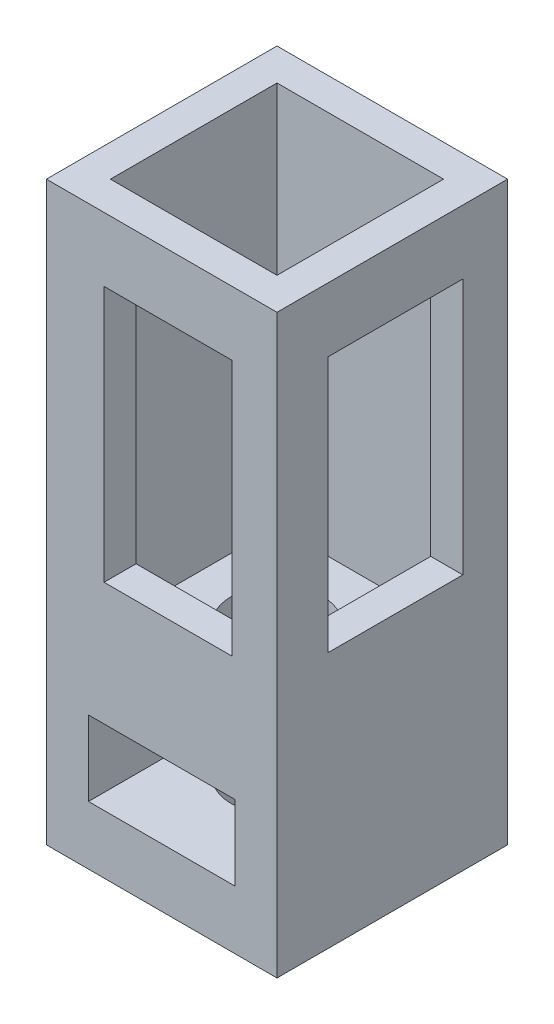
ISO-10303-21;
HEADER;
FILE_DESCRIPTION(('STEP AP214'),'2;1');
FILE_NAME('part.step','',(''),(''),'','','');
FILE_SCHEMA(('AUTOMOTIVE_DESIGN { 1 0 10303 214 1 1 1 1 }'));
ENDSEC;
DATA;
#1=APPLICATION_CONTEXT('core data for automotive mechanical design processes');
#2=APPLICATION_PROTOCOL_DEFINITION('international standard','automotive_design',2000,#1);
#3=PRODUCT_CONTEXT('',#1,'mechanical');
#4=PRODUCT('Part','Part','',(#3));
#5=PRODUCT_RELATED_PRODUCT_CATEGORY('part','',(#4));
#6=PRODUCT_DEFINITION_FORMATION('','',#4);
#7=PRODUCT_DEFINITION_CONTEXT('part definition',#1,'design');
#8=PRODUCT_DEFINITION('design','',#6,#7);
#9=PRODUCT_DEFINITION_SHAPE('','',#8);
#10=(LENGTH_UNIT() NAMED_UNIT(*) SI_UNIT(.MILLI.,.METRE.));
#11=(NAMED_UNIT(*) PLANE_ANGLE_UNIT() SI_UNIT($,.RADIAN.));
#12=(NAMED_UNIT(*) SI_UNIT($,.STERADIAN.) SOLID_ANGLE_UNIT());
#13=UNCERTAINTY_MEASURE_WITH_UNIT(LENGTH_MEASURE(1.E-05),#10,'distance_accuracy_value','');
#14=(GEOMETRIC_REPRESENTATION_CONTEXT(3) GLOBAL_UNCERTAINTY_ASSIGNED_CONTEXT((#13)) GLOBAL_UNIT_ASSIGNED_CONTEXT((#10,
#11,#12)) REPRESENTATION_CONTEXT('',''));
#15=CARTESIAN_POINT('',(0.,0.,0.));
#16=DIRECTION('',(0.,0.,1.));
#17=DIRECTION('',(1.,0.,0.));
#18=AXIS2_PLACEMENT_3D('',#15,#16,#17);
#19=CARTESIAN_POINT('',(0.,35.,0.));
#20=DIRECTION('',(1.,0.,0.));
#21=DIRECTION('',(0.,0.,-1.));
#22=AXIS2_PLACEMENT_3D('',#19,#20,#21);
#23=PLANE('',#22);
#24=DIRECTION('',(0.,-1.,0.));
#25=VECTOR('',#24,1.);
#26=CARTESIAN_POINT('',(0.,35.,-18.));
#27=LINE('',#26,#25);
#28=CARTESIAN_POINT('',(0.,35.,-18.));
#29=VERTEX_POINT('',#28);
#30=CARTESIAN_POINT('',(0.,-10.,-18.));
#31=VERTEX_POINT('',#30);
#32=EDGE_CURVE('E321',#29,#31,#27,.T.);
#33=ORIENTED_EDGE('',*,*,#32,.T.);
#34=DIRECTION('',(0.,0.,-1.));
#35=VECTOR('',#34,1.);
#36=CARTESIAN_POINT('',(0.,-10.,0.));
#37=LINE('',#36,#35);
#38=CARTESIAN_POINT('',(0.,-10.,0.));
#39=VERTEX_POINT('',#38);
#40=EDGE_CURVE('E231',#39,#31,#37,.T.);
#41=ORIENTED_EDGE('',*,*,#40,.F.);
#42=DIRECTION('',(0.,-1.,0.));
#43=VECTOR('',#42,1.);
#44=CARTESIAN_POINT('',(0.,35.,0.));
#45=LINE('',#44,#43);
#46=CARTESIAN_POINT('',(0.,35.,0.));
#47=VERTEX_POINT('',#46);
#48=EDGE_CURVE('E11',#47,#39,#45,.T.);
#49=ORIENTED_EDGE('',*,*,#48,.F.);
#50=DIRECTION('',(0.,0.,1.));
#51=VECTOR('',#50,1.);
#52=CARTESIAN_POINT('',(0.,35.,0.));
#53=LINE('',#52,#51);
#54=EDGE_CURVE('E306',#29,#47,#53,.T.);
#55=ORIENTED_EDGE('',*,*,#54,.F.);
#56=EDGE_LOOP('',(#33,#41,#49,#55));
#57=FACE_BOUND('',#56,.T.);
#58=ADVANCED_FACE('F32',(#57),#23,.F.);
#59=CARTESIAN_POINT('',(0.,35.,0.));
#60=DIRECTION('',(0.,0.,-1.));
#61=DIRECTION('',(-1.,0.,0.));
#62=AXIS2_PLACEMENT_3D('',#59,#60,#61);
#63=PLANE('',#62);
#64=DIRECTION('',(0.,1.,0.));
#65=VECTOR('',#64,1.);
#66=CARTESIAN_POINT('',(14.5,30.,0.));
#67=LINE('',#66,#65);
#68=CARTESIAN_POINT('',(14.5,10.,0.));
#69=VERTEX_POINT('',#68);
#70=CARTESIAN_POINT('',(14.5,30.,0.));
#71=VERTEX_POINT('',#70);
#72=EDGE_CURVE('E375',#69,#71,#67,.T.);
#73=ORIENTED_EDGE('',*,*,#72,.F.);
#74=DIRECTION('',(1.,0.,0.));
#75=VECTOR('',#74,1.);
#76=CARTESIAN_POINT('',(4.5,10.,0.));
#77=LINE('',#76,#75);
#78=CARTESIAN_POINT('',(4.5,10.,0.));
#79=VERTEX_POINT('',#78);
#80=EDGE_CURVE('E610',#79,#69,#77,.T.);
#81=ORIENTED_EDGE('',*,*,#80,.F.);
#82=DIRECTION('',(0.,-1.,0.));
#83=VECTOR('',#82,1.);
#84=CARTESIAN_POINT('',(4.5,30.,0.));
#85=LINE('',#84,#83);
#86=CARTESIAN_POINT('',(4.5,30.,0.));
#87=VERTEX_POINT('',#86);
#88=EDGE_CURVE('E188',#87,#79,#85,.T.);
#89=ORIENTED_EDGE('',*,*,#88,.F.);
#90=DIRECTION('',(-1.,0.,0.));
#91=VECTOR('',#90,1.);
#92=CARTESIAN_POINT('',(4.5,30.,0.));
#93=LINE('',#92,#91);
#94=EDGE_CURVE('E47',#71,#87,#93,.T.);
#95=ORIENTED_EDGE('',*,*,#94,.F.);
#96=EDGE_LOOP('',(#73,#81,#89,#95));
#97=FACE_BOUND('',#96,.T.);
#98=DIRECTION('',(1.,0.,0.));
#99=VECTOR('',#98,1.);
#100=CARTESIAN_POINT('',(3.285,-5.425,0.));
#101=LINE('',#100,#99);
#102=CARTESIAN_POINT('',(3.285,-5.425,0.));
#103=VERTEX_POINT('',#102);
#104=CARTESIAN_POINT('',(14.715,-5.425,0.));
#105=VERTEX_POINT('',#104);
#106=EDGE_CURVE('E221',#103,#105,#101,.T.);
#107=ORIENTED_EDGE('',*,*,#106,.F.);
#108=DIRECTION('',(0.,-1.,0.));
#109=VECTOR('',#108,1.);
#110=CARTESIAN_POINT('',(3.285,0.424999999999999,0.));
#111=LINE('',#110,#109);
#112=CARTESIAN_POINT('',(3.285,0.424999999999999,0.));
#113=VERTEX_POINT('',#112);
#114=EDGE_CURVE('E205',#113,#103,#111,.T.);
#115=ORIENTED_EDGE('',*,*,#114,.F.);
#116=DIRECTION('',(-1.,0.,0.));
#117=VECTOR('',#116,1.);
#118=CARTESIAN_POINT('',(3.285,0.424999999999999,0.));
#119=LINE('',#118,#117);
#120=CARTESIAN_POINT('',(14.715,0.424999999999999,0.));
#121=VERTEX_POINT('',#120);
#122=EDGE_CURVE('E210',#121,#113,#119,.T.);
#123=ORIENTED_EDGE('',*,*,#122,.F.);
#124=DIRECTION('',(0.,1.,0.));
#125=VECTOR('',#124,1.);
#126=CARTESIAN_POINT('',(14.715,0.424999999999999,0.));
#127=LINE('',#126,#125);
#128=EDGE_CURVE('E224',#105,#121,#127,.T.);
#129=ORIENTED_EDGE('',*,*,#128,.F.);
#130=EDGE_LOOP('',(#107,#115,#123,#129));
#131=FACE_BOUND('',#130,.T.);
#132=ORIENTED_EDGE('',*,*,#48,.T.);
#133=DIRECTION('',(-1.,0.,0.));
#134=VECTOR('',#133,1.);
#135=CARTESIAN_POINT('',(0.,-10.,0.));
#136=LINE('',#135,#134);
#137=CARTESIAN_POINT('',(18.,-10.,0.));
#138=VERTEX_POINT('',#137);
#139=EDGE_CURVE('E246',#138,#39,#136,.T.);
#140=ORIENTED_EDGE('',*,*,#139,.F.);
#141=DIRECTION('',(0.,-1.,0.));
#142=VECTOR('',#141,1.);
#143=CARTESIAN_POINT('',(18.,35.,0.));
#144=LINE('',#143,#142);
#145=CARTESIAN_POINT('',(18.,35.,0.));
#146=VERTEX_POINT('',#145);
#147=EDGE_CURVE('E40',#146,#138,#144,.T.);
#148=ORIENTED_EDGE('',*,*,#147,.F.);
#149=DIRECTION('',(1.,0.,0.));
#150=VECTOR('',#149,1.);
#151=CARTESIAN_POINT('',(0.,35.,0.));
#152=LINE('',#151,#150);
#153=EDGE_CURVE('E315',#47,#146,#152,.T.);
#154=ORIENTED_EDGE('',*,*,#153,.F.);
#155=EDGE_LOOP('',(#132,#140,#148,#154));
#156=FACE_BOUND('',#155,.T.);
#157=ADVANCED_FACE('F337',(#97,#131,#156),#63,.F.);
#158=CARTESIAN_POINT('',(18.,35.,0.));
#159=DIRECTION('',(-1.,0.,0.));
#160=DIRECTION('',(0.,0.,1.));
#161=AXIS2_PLACEMENT_3D('',#158,#159,#160);
#162=PLANE('',#161);
#163=DIRECTION('',(0.,1.,0.));
#164=VECTOR('',#163,1.);
#165=CARTESIAN_POINT('',(18.,30.,-14.5));
#166=LINE('',#165,#164);
#167=CARTESIAN_POINT('',(18.,10.,-14.5));
#168=VERTEX_POINT('',#167);
#169=CARTESIAN_POINT('',(18.,30.,-14.5));
#170=VERTEX_POINT('',#169);
#171=EDGE_CURVE('E255',#168,#170,#166,.T.);
#172=ORIENTED_EDGE('',*,*,#171,.F.);
#173=DIRECTION('',(0.,0.,-1.));
#174=VECTOR('',#173,1.);
#175=CARTESIAN_POINT('',(18.,10.,-4.));
#176=LINE('',#175,#174);
#177=CARTESIAN_POINT('',(18.,10.,-4.));
#178=VERTEX_POINT('',#177);
#179=EDGE_CURVE('E258',#178,#168,#176,.T.);
#180=ORIENTED_EDGE('',*,*,#179,.F.);
#181=DIRECTION('',(0.,-1.,0.));
#182=VECTOR('',#181,1.);
#183=CARTESIAN_POINT('',(18.,30.,-4.));
#184=LINE('',#183,#182);
#185=CARTESIAN_POINT('',(18.,30.,-4.));
#186=VERTEX_POINT('',#185);
#187=EDGE_CURVE('E261',#186,#178,#184,.T.);
#188=ORIENTED_EDGE('',*,*,#187,.F.);
#189=DIRECTION('',(0.,0.,1.));
#190=VECTOR('',#189,1.);
#191=CARTESIAN_POINT('',(18.,30.,-4.));
#192=LINE('',#191,#190);
#193=EDGE_CURVE('E252',#170,#186,#192,.T.);
#194=ORIENTED_EDGE('',*,*,#193,.F.);
#195=EDGE_LOOP('',(#172,#180,#188,#194));
#196=FACE_BOUND('',#195,.T.);
#197=ORIENTED_EDGE('',*,*,#147,.T.);
#198=DIRECTION('',(0.,0.,1.));
#199=VECTOR('',#198,1.);
#200=CARTESIAN_POINT('',(18.,-10.,0.));
#201=LINE('',#200,#199);
#202=CARTESIAN_POINT('',(18.,-10.,-18.));
#203=VERTEX_POINT('',#202);
#204=EDGE_CURVE('E243',#203,#138,#201,.T.);
#205=ORIENTED_EDGE('',*,*,#204,.F.);
#206=DIRECTION('',(0.,-1.,0.));
#207=VECTOR('',#206,1.);
#208=CARTESIAN_POINT('',(18.,35.,-18.));
#209=LINE('',#208,#207);
#210=CARTESIAN_POINT('',(18.,35.,-18.));
#211=VERTEX_POINT('',#210);
#212=EDGE_CURVE('E323',#211,#203,#209,.T.);
#213=ORIENTED_EDGE('',*,*,#212,.F.);
#214=DIRECTION('',(0.,0.,-1.));
#215=VECTOR('',#214,1.);
#216=CARTESIAN_POINT('',(18.,35.,0.));
#217=LINE('',#216,#215);
#218=EDGE_CURVE('E317',#146,#211,#217,.T.);
#219=ORIENTED_EDGE('',*,*,#218,.F.);
#220=EDGE_LOOP('',(#197,#205,#213,#219));
#221=FACE_BOUND('',#220,.T.);
#222=ADVANCED_FACE('F329',(#196,#221),#162,.F.);
#223=CARTESIAN_POINT('',(0.,35.,-18.));
#224=DIRECTION('',(0.,0.,1.));
#225=DIRECTION('',(1.,0.,0.));
#226=AXIS2_PLACEMENT_3D('',#223,#224,#225);
#227=PLANE('',#226);
#228=DIRECTION('',(-1.,0.,0.));
#229=VECTOR('',#228,1.);
#230=CARTESIAN_POINT('',(3.285,0.424999999999999,-18.));
#231=LINE('',#230,#229);
#232=CARTESIAN_POINT('',(14.715,0.424999999999999,-18.));
#233=VERTEX_POINT('',#232);
#234=CARTESIAN_POINT('',(3.285,0.424999999999999,-18.));
#235=VERTEX_POINT('',#234);
#236=EDGE_CURVE('E216',#233,#235,#231,.T.);
#237=ORIENTED_EDGE('',*,*,#236,.T.);
#238=DIRECTION('',(0.,-1.,0.));
#239=VECTOR('',#238,1.);
#240=CARTESIAN_POINT('',(3.285,0.424999999999999,-18.));
#241=LINE('',#240,#239);
#242=CARTESIAN_POINT('',(3.285,-5.425,-18.));
#243=VERTEX_POINT('',#242);
#244=EDGE_CURVE('E206',#235,#243,#241,.T.);
#245=ORIENTED_EDGE('',*,*,#244,.T.);
#246=DIRECTION('',(1.,0.,0.));
#247=VECTOR('',#246,1.);
#248=CARTESIAN_POINT('',(3.285,-5.425,-18.));
#249=LINE('',#248,#247);
#250=CARTESIAN_POINT('',(14.715,-5.425,-18.));
#251=VERTEX_POINT('',#250);
#252=EDGE_CURVE('E209',#243,#251,#249,.T.);
#253=ORIENTED_EDGE('',*,*,#252,.T.);
#254=DIRECTION('',(0.,1.,0.));
#255=VECTOR('',#254,1.);
#256=CARTESIAN_POINT('',(14.715,0.424999999999999,-18.));
#257=LINE('',#256,#255);
#258=EDGE_CURVE('E213',#251,#233,#257,.T.);
#259=ORIENTED_EDGE('',*,*,#258,.T.);
#260=EDGE_LOOP('',(#237,#245,#253,#259));
#261=FACE_BOUND('',#260,.T.);
#262=ORIENTED_EDGE('',*,*,#212,.T.);
#263=DIRECTION('',(1.,0.,0.));
#264=VECTOR('',#263,1.);
#265=CARTESIAN_POINT('',(0.,-10.,-18.));
#266=LINE('',#265,#264);
#267=EDGE_CURVE('E240',#31,#203,#266,.T.);
#268=ORIENTED_EDGE('',*,*,#267,.F.);
#269=ORIENTED_EDGE('',*,*,#32,.F.);
#270=DIRECTION('',(-1.,0.,0.));
#271=VECTOR('',#270,1.);
#272=CARTESIAN_POINT('',(0.,35.,-18.));
#273=LINE('',#272,#271);
#274=EDGE_CURVE('E319',#211,#29,#273,.T.);
#275=ORIENTED_EDGE('',*,*,#274,.F.);
#276=EDGE_LOOP('',(#262,#268,#269,#275));
#277=FACE_BOUND('',#276,.T.);
#278=ADVANCED_FACE('F344',(#261,#277),#227,.F.);
#279=CARTESIAN_POINT('',(0.,35.,0.));
#280=DIRECTION('',(0.,-1.,0.));
#281=DIRECTION('',(0.,0.,-1.));
#282=AXIS2_PLACEMENT_3D('',#279,#280,#281);
#283=PLANE('',#282);
#284=DIRECTION('',(1.,0.,0.));
#285=VECTOR('',#284,1.);
#286=CARTESIAN_POINT('',(2.5,35.,-2.5));
#287=LINE('',#286,#285);
#288=CARTESIAN_POINT('',(2.5,35.,-2.5));
#289=VERTEX_POINT('',#288);
#290=CARTESIAN_POINT('',(15.5,35.,-2.5));
#291=VERTEX_POINT('',#290);
#292=EDGE_CURVE('E296',#289,#291,#287,.T.);
#293=ORIENTED_EDGE('',*,*,#292,.F.);
#294=DIRECTION('',(0.,0.,1.));
#295=VECTOR('',#294,1.);
#296=CARTESIAN_POINT('',(2.5,35.,-15.5));
#297=LINE('',#296,#295);
#298=CARTESIAN_POINT('',(2.5,35.,-15.5));
#299=VERTEX_POINT('',#298);
#300=EDGE_CURVE('E280',#299,#289,#297,.T.);
#301=ORIENTED_EDGE('',*,*,#300,.F.);
#302=DIRECTION('',(-1.,0.,0.));
#303=VECTOR('',#302,1.);
#304=CARTESIAN_POINT('',(2.5,35.,-15.5));
#305=LINE('',#304,#303);
#306=CARTESIAN_POINT('',(15.5,35.,-15.5));
#307=VERTEX_POINT('',#306);
#308=EDGE_CURVE('E285',#307,#299,#305,.T.);
#309=ORIENTED_EDGE('',*,*,#308,.F.);
#310=DIRECTION('',(0.,0.,-1.));
#311=VECTOR('',#310,1.);
#312=CARTESIAN_POINT('',(15.5,35.,-15.5));
#313=LINE('',#312,#311);
#314=EDGE_CURVE('E299',#291,#307,#313,.T.);
#315=ORIENTED_EDGE('',*,*,#314,.F.);
#316=EDGE_LOOP('',(#293,#301,#309,#315));
#317=FACE_BOUND('',#316,.T.);
#318=ORIENTED_EDGE('',*,*,#54,.T.);
#319=ORIENTED_EDGE('',*,*,#153,.T.);
#320=ORIENTED_EDGE('',*,*,#218,.T.);
#321=ORIENTED_EDGE('',*,*,#274,.T.);
#322=EDGE_LOOP('',(#318,#319,#320,#321));
#323=FACE_BOUND('',#322,.T.);
#324=ADVANCED_FACE('F346',(#317,#323),#283,.F.);
#325=CARTESIAN_POINT('',(2.5,5.,-15.5));
#326=DIRECTION('',(-1.,0.,0.));
#327=DIRECTION('',(0.,0.,1.));
#328=AXIS2_PLACEMENT_3D('',#325,#326,#327);
#329=PLANE('',#328);
#330=ORIENTED_EDGE('',*,*,#300,.T.);
#331=DIRECTION('',(0.,1.,0.));
#332=VECTOR('',#331,1.);
#333=CARTESIAN_POINT('',(2.5,5.,-2.5));
#334=LINE('',#333,#332);
#335=CARTESIAN_POINT('',(2.5,5.,-2.5));
#336=VERTEX_POINT('',#335);
#337=EDGE_CURVE('E294',#336,#289,#334,.T.);
#338=ORIENTED_EDGE('',*,*,#337,.F.);
#339=DIRECTION('',(0.,0.,1.));
#340=VECTOR('',#339,1.);
#341=CARTESIAN_POINT('',(2.5,5.,-15.5));
#342=LINE('',#341,#340);
#343=CARTESIAN_POINT('',(2.5,5.,-15.5));
#344=VERTEX_POINT('',#343);
#345=EDGE_CURVE('E281',#344,#336,#342,.T.);
#346=ORIENTED_EDGE('',*,*,#345,.F.);
#347=DIRECTION('',(0.,1.,0.));
#348=VECTOR('',#347,1.);
#349=CARTESIAN_POINT('',(2.5,5.,-15.5));
#350=LINE('',#349,#348);
#351=EDGE_CURVE('E304',#344,#299,#350,.T.);
#352=ORIENTED_EDGE('',*,*,#351,.T.);
#353=EDGE_LOOP('',(#330,#338,#346,#352));
#354=FACE_BOUND('',#353,.T.);
#355=ADVANCED_FACE('F348',(#354),#329,.F.);
#356=CARTESIAN_POINT('',(2.5,5.,-15.5));
#357=DIRECTION('',(0.,0.,-1.));
#358=DIRECTION('',(-1.,0.,0.));
#359=AXIS2_PLACEMENT_3D('',#356,#357,#358);
#360=PLANE('',#359);
#361=ORIENTED_EDGE('',*,*,#308,.T.);
#362=ORIENTED_EDGE('',*,*,#351,.F.);
#363=DIRECTION('',(-1.,0.,0.));
#364=VECTOR('',#363,1.);
#365=CARTESIAN_POINT('',(2.5,5.,-15.5));
#366=LINE('',#365,#364);
#367=CARTESIAN_POINT('',(15.5,5.,-15.5));
#368=VERTEX_POINT('',#367);
#369=EDGE_CURVE('E291',#368,#344,#366,.T.);
#370=ORIENTED_EDGE('',*,*,#369,.F.);
#371=DIRECTION('',(0.,1.,0.));
#372=VECTOR('',#371,1.);
#373=CARTESIAN_POINT('',(15.5,5.,-15.5));
#374=LINE('',#373,#372);
#375=EDGE_CURVE('E307',#368,#307,#374,.T.);
#376=ORIENTED_EDGE('',*,*,#375,.T.);
#377=EDGE_LOOP('',(#361,#362,#370,#376));
#378=FACE_BOUND('',#377,.T.);
#379=ADVANCED_FACE('F355',(#378),#360,.F.);
#380=CARTESIAN_POINT('',(15.5,5.,-15.5));
#381=DIRECTION('',(1.,0.,0.));
#382=DIRECTION('',(0.,0.,-1.));
#383=AXIS2_PLACEMENT_3D('',#380,#381,#382);
#384=PLANE('',#383);
#385=DIRECTION('',(0.,1.,0.));
#386=VECTOR('',#385,1.);
#387=CARTESIAN_POINT('',(15.5,30.,-4.));
#388=LINE('',#387,#386);
#389=CARTESIAN_POINT('',(15.5,10.,-4.));
#390=VERTEX_POINT('',#389);
#391=CARTESIAN_POINT('',(15.5,30.,-4.));
#392=VERTEX_POINT('',#391);
#393=EDGE_CURVE('E251',#390,#392,#388,.T.);
#394=ORIENTED_EDGE('',*,*,#393,.F.);
#395=DIRECTION('',(0.,0.,1.));
#396=VECTOR('',#395,1.);
#397=CARTESIAN_POINT('',(15.5,10.,-4.));
#398=LINE('',#397,#396);
#399=CARTESIAN_POINT('',(15.5,10.,-14.5));
#400=VERTEX_POINT('',#399);
#401=EDGE_CURVE('E249',#400,#390,#398,.T.);
#402=ORIENTED_EDGE('',*,*,#401,.F.);
#403=DIRECTION('',(0.,-1.,0.));
#404=VECTOR('',#403,1.);
#405=CARTESIAN_POINT('',(15.5,30.,-14.5));
#406=LINE('',#405,#404);
#407=CARTESIAN_POINT('',(15.5,30.,-14.5));
#408=VERTEX_POINT('',#407);
#409=EDGE_CURVE('E264',#408,#400,#406,.T.);
#410=ORIENTED_EDGE('',*,*,#409,.F.);
#411=DIRECTION('',(0.,0.,-1.));
#412=VECTOR('',#411,1.);
#413=CARTESIAN_POINT('',(15.5,30.,-4.));
#414=LINE('',#413,#412);
#415=EDGE_CURVE('E267',#392,#408,#414,.T.);
#416=ORIENTED_EDGE('',*,*,#415,.F.);
#417=EDGE_LOOP('',(#394,#402,#410,#416));
#418=FACE_BOUND('',#417,.T.);
#419=ORIENTED_EDGE('',*,*,#314,.T.);
#420=ORIENTED_EDGE('',*,*,#375,.F.);
#421=DIRECTION('',(0.,0.,-1.));
#422=VECTOR('',#421,1.);
#423=CARTESIAN_POINT('',(15.5,5.,-15.5));
#424=LINE('',#423,#422);
#425=CARTESIAN_POINT('',(15.5,5.,-2.5));
#426=VERTEX_POINT('',#425);
#427=EDGE_CURVE('E288',#426,#368,#424,.T.);
#428=ORIENTED_EDGE('',*,*,#427,.F.);
#429=DIRECTION('',(0.,1.,0.));
#430=VECTOR('',#429,1.);
#431=CARTESIAN_POINT('',(15.5,5.,-2.5));
#432=LINE('',#431,#430);
#433=EDGE_CURVE('E309',#426,#291,#432,.T.);
#434=ORIENTED_EDGE('',*,*,#433,.T.);
#435=EDGE_LOOP('',(#419,#420,#428,#434));
#436=FACE_BOUND('',#435,.T.);
#437=ADVANCED_FACE('F432',(#418,#436),#384,.F.);
#438=CARTESIAN_POINT('',(2.5,5.,-2.5));
#439=DIRECTION('',(0.,0.,1.));
#440=DIRECTION('',(1.,0.,0.));
#441=AXIS2_PLACEMENT_3D('',#438,#439,#440);
#442=PLANE('',#441);
#443=DIRECTION('',(0.,1.,0.));
#444=VECTOR('',#443,1.);
#445=CARTESIAN_POINT('',(4.5,30.,-2.5));
#446=LINE('',#445,#444);
#447=CARTESIAN_POINT('',(4.5,10.,-2.5));
#448=VERTEX_POINT('',#447);
#449=CARTESIAN_POINT('',(4.5,30.,-2.5));
#450=VERTEX_POINT('',#449);
#451=EDGE_CURVE('E179',#448,#450,#446,.T.);
#452=ORIENTED_EDGE('',*,*,#451,.F.);
#453=DIRECTION('',(-1.,0.,0.));
#454=VECTOR('',#453,1.);
#455=CARTESIAN_POINT('',(4.5,10.,-2.5));
#456=LINE('',#455,#454);
#457=CARTESIAN_POINT('',(14.5,10.,-2.5));
#458=VERTEX_POINT('',#457);
#459=EDGE_CURVE('E55',#458,#448,#456,.T.);
#460=ORIENTED_EDGE('',*,*,#459,.F.);
#461=DIRECTION('',(0.,-1.,0.));
#462=VECTOR('',#461,1.);
#463=CARTESIAN_POINT('',(14.5,30.,-2.5));
#464=LINE('',#463,#462);
#465=CARTESIAN_POINT('',(14.5,30.,-2.5));
#466=VERTEX_POINT('',#465);
#467=EDGE_CURVE('E186',#466,#458,#464,.T.);
#468=ORIENTED_EDGE('',*,*,#467,.F.);
#469=DIRECTION('',(1.,0.,0.));
#470=VECTOR('',#469,1.);
#471=CARTESIAN_POINT('',(4.5,30.,-2.5));
#472=LINE('',#471,#470);
#473=EDGE_CURVE('E170',#450,#466,#472,.T.);
#474=ORIENTED_EDGE('',*,*,#473,.F.);
#475=EDGE_LOOP('',(#452,#460,#468,#474));
#476=FACE_BOUND('',#475,.T.);
#477=ORIENTED_EDGE('',*,*,#292,.T.);
#478=ORIENTED_EDGE('',*,*,#433,.F.);
#479=DIRECTION('',(1.,0.,0.));
#480=VECTOR('',#479,1.);
#481=CARTESIAN_POINT('',(2.5,5.,-2.5));
#482=LINE('',#481,#480);
#483=EDGE_CURVE('E284',#336,#426,#482,.T.);
#484=ORIENTED_EDGE('',*,*,#483,.F.);
#485=ORIENTED_EDGE('',*,*,#337,.T.);
#486=EDGE_LOOP('',(#477,#478,#484,#485));
#487=FACE_BOUND('',#486,.T.);
#488=ADVANCED_FACE('F183',(#476,#487),#442,.F.);
#489=CARTESIAN_POINT('',(0.,5.,0.));
#490=DIRECTION('',(0.,1.,0.));
#491=DIRECTION('',(0.,0.,1.));
#492=AXIS2_PLACEMENT_3D('',#489,#490,#491);
#493=PLANE('',#492);
#494=CARTESIAN_POINT('',(9.,5.,-9.));
#495=DIRECTION('',(0.,-1.,0.));
#496=DIRECTION('',(0.,0.,-1.));
#497=AXIS2_PLACEMENT_3D('',#494,#495,#496);
#498=CIRCLE('',#497,3.57123999999999);
#499=CARTESIAN_POINT('',(9.,5.,-12.57124));
#500=VERTEX_POINT('',#499);
#501=EDGE_CURVE('E199',#500,#500,#498,.T.);
#502=ORIENTED_EDGE('',*,*,#501,.T.);
#503=EDGE_LOOP('',(#502));
#504=FACE_BOUND('',#503,.T.);
#505=ORIENTED_EDGE('',*,*,#345,.T.);
#506=ORIENTED_EDGE('',*,*,#483,.T.);
#507=ORIENTED_EDGE('',*,*,#427,.T.);
#508=ORIENTED_EDGE('',*,*,#369,.T.);
#509=EDGE_LOOP('',(#505,#506,#507,#508));
#510=FACE_BOUND('',#509,.T.);
#511=ADVANCED_FACE('F425',(#504,#510),#493,.T.);
#512=CARTESIAN_POINT('',(-0.001000000000001,10.,-4.));
#513=DIRECTION('',(0.,-1.,0.));
#514=DIRECTION('',(0.,0.,-1.));
#515=AXIS2_PLACEMENT_3D('',#512,#513,#514);
#516=PLANE('',#515);
#517=ORIENTED_EDGE('',*,*,#401,.T.);
#518=DIRECTION('',(1.,0.,0.));
#519=VECTOR('',#518,1.);
#520=CARTESIAN_POINT('',(-0.001000000000001,10.,-4.));
#521=LINE('',#520,#519);
#522=EDGE_CURVE('E275',#390,#178,#521,.T.);
#523=ORIENTED_EDGE('',*,*,#522,.T.);
#524=ORIENTED_EDGE('',*,*,#179,.T.);
#525=DIRECTION('',(1.,0.,0.));
#526=VECTOR('',#525,1.);
#527=CARTESIAN_POINT('',(-0.001000000000001,10.,-14.5));
#528=LINE('',#527,#526);
#529=EDGE_CURVE('E254',#400,#168,#528,.T.);
#530=ORIENTED_EDGE('',*,*,#529,.F.);
#531=EDGE_LOOP('',(#517,#523,#524,#530));
#532=FACE_BOUND('',#531,.T.);
#533=ADVANCED_FACE('F421',(#532),#516,.F.);
#534=CARTESIAN_POINT('',(-0.001000000000001,30.,-14.5));
#535=DIRECTION('',(0.,0.,-1.));
#536=DIRECTION('',(-1.,0.,0.));
#537=AXIS2_PLACEMENT_3D('',#534,#535,#536);
#538=PLANE('',#537);
#539=ORIENTED_EDGE('',*,*,#409,.T.);
#540=ORIENTED_EDGE('',*,*,#529,.T.);
#541=ORIENTED_EDGE('',*,*,#171,.T.);
#542=DIRECTION('',(1.,0.,0.));
#543=VECTOR('',#542,1.);
#544=CARTESIAN_POINT('',(-0.001000000000001,30.,-14.5));
#545=LINE('',#544,#543);
#546=EDGE_CURVE('E276',#408,#170,#545,.T.);
#547=ORIENTED_EDGE('',*,*,#546,.F.);
#548=EDGE_LOOP('',(#539,#540,#541,#547));
#549=FACE_BOUND('',#548,.T.);
#550=ADVANCED_FACE('F417',(#549),#538,.F.);
#551=CARTESIAN_POINT('',(-0.001000000000001,30.,-4.));
#552=DIRECTION('',(0.,1.,0.));
#553=DIRECTION('',(0.,0.,1.));
#554=AXIS2_PLACEMENT_3D('',#551,#552,#553);
#555=PLANE('',#554);
#556=ORIENTED_EDGE('',*,*,#415,.T.);
#557=ORIENTED_EDGE('',*,*,#546,.T.);
#558=ORIENTED_EDGE('',*,*,#193,.T.);
#559=DIRECTION('',(1.,0.,0.));
#560=VECTOR('',#559,1.);
#561=CARTESIAN_POINT('',(-0.001000000000001,30.,-4.));
#562=LINE('',#561,#560);
#563=EDGE_CURVE('E272',#392,#186,#562,.T.);
#564=ORIENTED_EDGE('',*,*,#563,.F.);
#565=EDGE_LOOP('',(#556,#557,#558,#564));
#566=FACE_BOUND('',#565,.T.);
#567=ADVANCED_FACE('F413',(#566),#555,.F.);
#568=CARTESIAN_POINT('',(-0.001000000000001,30.,-4.));
#569=DIRECTION('',(0.,0.,1.));
#570=DIRECTION('',(1.,0.,0.));
#571=AXIS2_PLACEMENT_3D('',#568,#569,#570);
#572=PLANE('',#571);
#573=ORIENTED_EDGE('',*,*,#393,.T.);
#574=ORIENTED_EDGE('',*,*,#563,.T.);
#575=ORIENTED_EDGE('',*,*,#187,.T.);
#576=ORIENTED_EDGE('',*,*,#522,.F.);
#577=EDGE_LOOP('',(#573,#574,#575,#576));
#578=FACE_BOUND('',#577,.T.);
#579=ADVANCED_FACE('F409',(#578),#572,.F.);
#580=CARTESIAN_POINT('',(0.,-10.,0.));
#581=DIRECTION('',(0.,-1.,0.));
#582=DIRECTION('',(0.,0.,-1.));
#583=AXIS2_PLACEMENT_3D('',#580,#581,#582);
#584=PLANE('',#583);
#585=CARTESIAN_POINT('',(9.,-10.,-9.));
#586=DIRECTION('',(0.,-1.,0.));
#587=DIRECTION('',(0.,0.,-1.));
#588=AXIS2_PLACEMENT_3D('',#585,#586,#587);
#589=CIRCLE('',#588,3.57124);
#590=CARTESIAN_POINT('',(9.,-10.,-12.57124));
#591=VERTEX_POINT('',#590);
#592=EDGE_CURVE('E196',#591,#591,#589,.T.);
#593=ORIENTED_EDGE('',*,*,#592,.F.);
#594=EDGE_LOOP('',(#593));
#595=FACE_BOUND('',#594,.T.);
#596=ORIENTED_EDGE('',*,*,#40,.T.);
#597=ORIENTED_EDGE('',*,*,#267,.T.);
#598=ORIENTED_EDGE('',*,*,#204,.T.);
#599=ORIENTED_EDGE('',*,*,#139,.T.);
#600=EDGE_LOOP('',(#596,#597,#598,#599));
#601=FACE_BOUND('',#600,.T.);
#602=ADVANCED_FACE('F334',(#595,#601),#584,.T.);
#603=CARTESIAN_POINT('',(3.285,0.424999999999999,-18.));
#604=DIRECTION('',(-1.,0.,0.));
#605=DIRECTION('',(0.,-1.,0.));
#606=AXIS2_PLACEMENT_3D('',#603,#604,#605);
#607=PLANE('',#606);
#608=ORIENTED_EDGE('',*,*,#114,.T.);
#609=DIRECTION('',(0.,0.,1.));
#610=VECTOR('',#609,1.);
#611=CARTESIAN_POINT('',(3.285,-5.425,-18.));
#612=LINE('',#611,#610);
#613=EDGE_CURVE('E219',#243,#103,#612,.T.);
#614=ORIENTED_EDGE('',*,*,#613,.F.);
#615=ORIENTED_EDGE('',*,*,#244,.F.);
#616=DIRECTION('',(0.,0.,1.));
#617=VECTOR('',#616,1.);
#618=CARTESIAN_POINT('',(3.285,0.424999999999999,-18.));
#619=LINE('',#618,#617);
#620=EDGE_CURVE('E229',#235,#113,#619,.T.);
#621=ORIENTED_EDGE('',*,*,#620,.T.);
#622=EDGE_LOOP('',(#608,#614,#615,#621));
#623=FACE_BOUND('',#622,.T.);
#624=ADVANCED_FACE('F386',(#623),#607,.F.);
#625=CARTESIAN_POINT('',(3.285,0.424999999999999,-18.));
#626=DIRECTION('',(0.,1.,0.));
#627=DIRECTION('',(0.,0.,1.));
#628=AXIS2_PLACEMENT_3D('',#625,#626,#627);
#629=PLANE('',#628);
#630=CARTESIAN_POINT('',(9.,0.425,-9.));
#631=DIRECTION('',(0.,1.,0.));
#632=DIRECTION('',(0.,0.,1.));
#633=AXIS2_PLACEMENT_3D('',#630,#631,#632);
#634=CIRCLE('',#633,3.57124);
#635=CARTESIAN_POINT('',(9.,0.425,-5.42876));
#636=VERTEX_POINT('',#635);
#637=EDGE_CURVE('E202',#636,#636,#634,.T.);
#638=ORIENTED_EDGE('',*,*,#637,.T.);
#639=EDGE_LOOP('',(#638));
#640=FACE_BOUND('',#639,.T.);
#641=ORIENTED_EDGE('',*,*,#122,.T.);
#642=ORIENTED_EDGE('',*,*,#620,.F.);
#643=ORIENTED_EDGE('',*,*,#236,.F.);
#644=DIRECTION('',(0.,0.,1.));
#645=VECTOR('',#644,1.);
#646=CARTESIAN_POINT('',(14.715,0.424999999999999,-18.));
#647=LINE('',#646,#645);
#648=EDGE_CURVE('E232',#233,#121,#647,.T.);
#649=ORIENTED_EDGE('',*,*,#648,.T.);
#650=EDGE_LOOP('',(#641,#642,#643,#649));
#651=FACE_BOUND('',#650,.T.);
#652=ADVANCED_FACE('F389',(#640,#651),#629,.F.);
#653=CARTESIAN_POINT('',(14.715,0.424999999999999,-18.));
#654=DIRECTION('',(1.,0.,0.));
#655=DIRECTION('',(0.,0.,-1.));
#656=AXIS2_PLACEMENT_3D('',#653,#654,#655);
#657=PLANE('',#656);
#658=ORIENTED_EDGE('',*,*,#128,.T.);
#659=ORIENTED_EDGE('',*,*,#648,.F.);
#660=ORIENTED_EDGE('',*,*,#258,.F.);
#661=DIRECTION('',(0.,0.,1.));
#662=VECTOR('',#661,1.);
#663=CARTESIAN_POINT('',(14.715,-5.425,-18.));
#664=LINE('',#663,#662);
#665=EDGE_CURVE('E234',#251,#105,#664,.T.);
#666=ORIENTED_EDGE('',*,*,#665,.T.);
#667=EDGE_LOOP('',(#658,#659,#660,#666));
#668=FACE_BOUND('',#667,.T.);
#669=ADVANCED_FACE('F391',(#668),#657,.F.);
#670=CARTESIAN_POINT('',(3.285,-5.425,-18.));
#671=DIRECTION('',(0.,-1.,0.));
#672=DIRECTION('',(0.,0.,-1.));
#673=AXIS2_PLACEMENT_3D('',#670,#671,#672);
#674=PLANE('',#673);
#675=CARTESIAN_POINT('',(9.,-5.425,-9.));
#676=DIRECTION('',(0.,-1.,0.));
#677=DIRECTION('',(0.,0.,-1.));
#678=AXIS2_PLACEMENT_3D('',#675,#676,#677);
#679=CIRCLE('',#678,3.57124);
#680=CARTESIAN_POINT('',(9.,-5.425,-12.57124));
#681=VERTEX_POINT('',#680);
#682=EDGE_CURVE('E35',#681,#681,#679,.T.);
#683=ORIENTED_EDGE('',*,*,#682,.T.);
#684=EDGE_LOOP('',(#683));
#685=FACE_BOUND('',#684,.T.);
#686=ORIENTED_EDGE('',*,*,#106,.T.);
#687=ORIENTED_EDGE('',*,*,#665,.F.);
#688=ORIENTED_EDGE('',*,*,#252,.F.);
#689=ORIENTED_EDGE('',*,*,#613,.T.);
#690=EDGE_LOOP('',(#686,#687,#688,#689));
#691=FACE_BOUND('',#690,.T.);
#692=ADVANCED_FACE('F382',(#685,#691),#674,.F.);
#693=CARTESIAN_POINT('',(9.,-10.,-9.));
#694=DIRECTION('',(0.,-1.,0.));
#695=DIRECTION('',(0.,0.,-1.));
#696=AXIS2_PLACEMENT_3D('',#693,#694,#695);
#697=CYLINDRICAL_SURFACE('',#696,3.57124);
#698=ORIENTED_EDGE('',*,*,#592,.T.);
#699=EDGE_LOOP('',(#698));
#700=FACE_BOUND('',#699,.T.);
#701=ORIENTED_EDGE('',*,*,#682,.F.);
#702=EDGE_LOOP('',(#701));
#703=FACE_BOUND('',#702,.T.);
#704=ADVANCED_FACE('F398',(#700,#703),#697,.F.);
#705=ORIENTED_EDGE('',*,*,#501,.F.);
#706=EDGE_LOOP('',(#705));
#707=FACE_BOUND('',#706,.T.);
#708=ORIENTED_EDGE('',*,*,#637,.F.);
#709=EDGE_LOOP('',(#708));
#710=FACE_BOUND('',#709,.T.);
#711=ADVANCED_FACE('F492',(#707,#710),#697,.F.);
#712=CARTESIAN_POINT('',(4.5,10.,-18.001));
#713=DIRECTION('',(0.,-1.,0.));
#714=DIRECTION('',(0.,0.,-1.));
#715=AXIS2_PLACEMENT_3D('',#712,#713,#714);
#716=PLANE('',#715);
#717=ORIENTED_EDGE('',*,*,#459,.T.);
#718=DIRECTION('',(0.,0.,1.));
#719=VECTOR('',#718,1.);
#720=CARTESIAN_POINT('',(4.5,10.,-18.001));
#721=LINE('',#720,#719);
#722=EDGE_CURVE('E175',#448,#79,#721,.T.);
#723=ORIENTED_EDGE('',*,*,#722,.T.);
#724=ORIENTED_EDGE('',*,*,#80,.T.);
#725=DIRECTION('',(0.,0.,1.));
#726=VECTOR('',#725,1.);
#727=CARTESIAN_POINT('',(14.5,10.,-18.001));
#728=LINE('',#727,#726);
#729=EDGE_CURVE('E193',#458,#69,#728,.T.);
#730=ORIENTED_EDGE('',*,*,#729,.F.);
#731=EDGE_LOOP('',(#717,#723,#724,#730));
#732=FACE_BOUND('',#731,.T.);
#733=ADVANCED_FACE('F500',(#732),#716,.F.);
#734=CARTESIAN_POINT('',(14.5,30.,-18.001));
#735=DIRECTION('',(1.,0.,0.));
#736=DIRECTION('',(0.,1.,0.));
#737=AXIS2_PLACEMENT_3D('',#734,#735,#736);
#738=PLANE('',#737);
#739=ORIENTED_EDGE('',*,*,#467,.T.);
#740=ORIENTED_EDGE('',*,*,#729,.T.);
#741=ORIENTED_EDGE('',*,*,#72,.T.);
#742=DIRECTION('',(0.,0.,1.));
#743=VECTOR('',#742,1.);
#744=CARTESIAN_POINT('',(14.5,30.,-18.001));
#745=LINE('',#744,#743);
#746=EDGE_CURVE('E176',#466,#71,#745,.T.);
#747=ORIENTED_EDGE('',*,*,#746,.F.);
#748=EDGE_LOOP('',(#739,#740,#741,#747));
#749=FACE_BOUND('',#748,.T.);
#750=ADVANCED_FACE('F576',(#749),#738,.F.);
#751=CARTESIAN_POINT('',(4.5,30.,-18.001));
#752=DIRECTION('',(0.,1.,0.));
#753=DIRECTION('',(-1.,0.,0.));
#754=AXIS2_PLACEMENT_3D('',#751,#752,#753);
#755=PLANE('',#754);
#756=ORIENTED_EDGE('',*,*,#473,.T.);
#757=ORIENTED_EDGE('',*,*,#746,.T.);
#758=ORIENTED_EDGE('',*,*,#94,.T.);
#759=DIRECTION('',(0.,0.,1.));
#760=VECTOR('',#759,1.);
#761=CARTESIAN_POINT('',(4.5,30.,-18.001));
#762=LINE('',#761,#760);
#763=EDGE_CURVE('E166',#450,#87,#762,.T.);
#764=ORIENTED_EDGE('',*,*,#763,.F.);
#765=EDGE_LOOP('',(#756,#757,#758,#764));
#766=FACE_BOUND('',#765,.T.);
#767=ADVANCED_FACE('F168',(#766),#755,.F.);
#768=CARTESIAN_POINT('',(4.5,30.,-18.001));
#769=DIRECTION('',(-1.,0.,0.));
#770=DIRECTION('',(0.,-1.,0.));
#771=AXIS2_PLACEMENT_3D('',#768,#769,#770);
#772=PLANE('',#771);
#773=ORIENTED_EDGE('',*,*,#451,.T.);
#774=ORIENTED_EDGE('',*,*,#763,.T.);
#775=ORIENTED_EDGE('',*,*,#88,.T.);
#776=ORIENTED_EDGE('',*,*,#722,.F.);
#777=EDGE_LOOP('',(#773,#774,#775,#776));
#778=FACE_BOUND('',#777,.T.);
#779=ADVANCED_FACE('F180',(#778),#772,.F.);
#780=CLOSED_SHELL('',(#58,#157,#222,#278,#324,#355,#379,#437,#488,#511,#533,#550,#567,#579,#602,
#624,#652,#669,#692,#704,#711,#733,#750,#767,#779));
#781=MANIFOLD_SOLID_BREP('B2',#780);
#782=ADVANCED_BREP_SHAPE_REPRESENTATION('',(#18,#781),#14);
#783=SHAPE_DEFINITION_REPRESENTATION(#9,#782);
ENDSEC;
END-ISO-10303-21;
